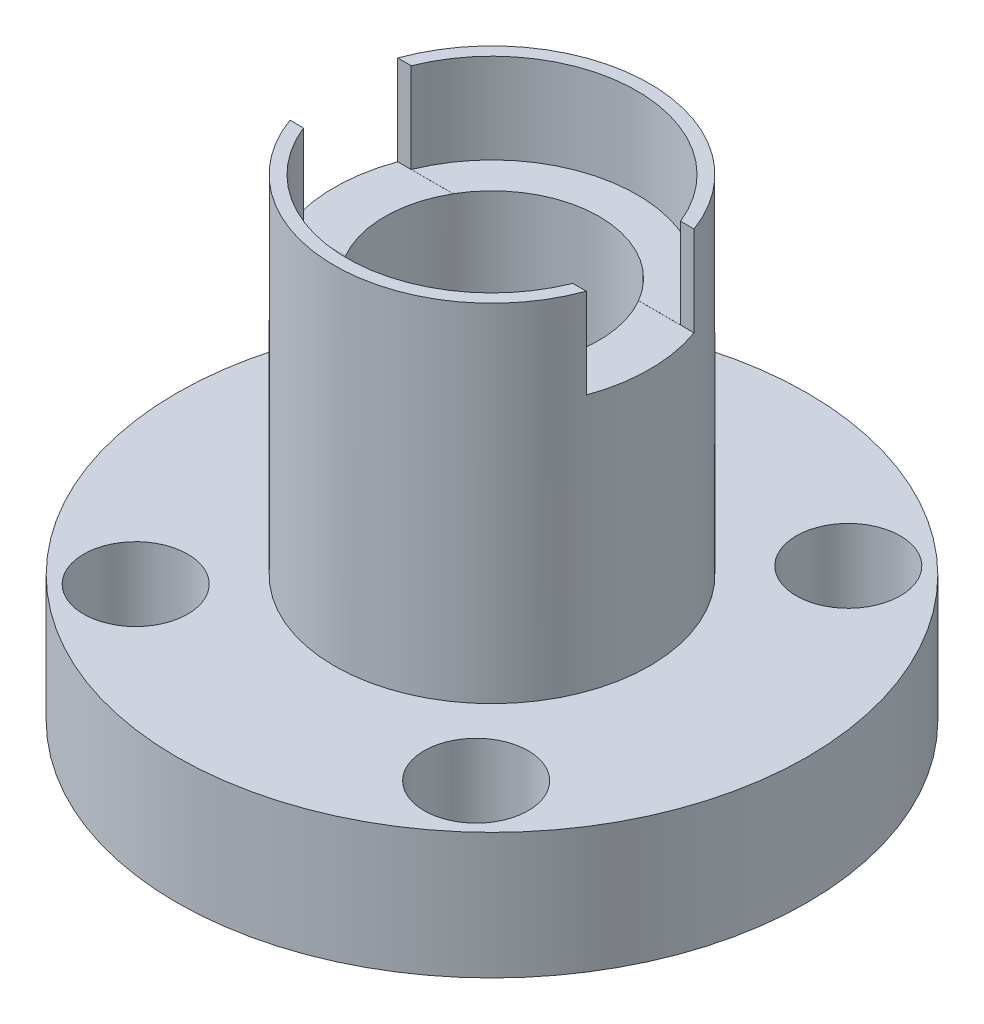
ISO-10303-21;
HEADER;
FILE_DESCRIPTION(('STEP AP214'),'2;1');
FILE_NAME('part.step','',(''),(''),'','','');
FILE_SCHEMA(('AUTOMOTIVE_DESIGN { 1 0 10303 214 1 1 1 1 }'));
ENDSEC;
DATA;
#1=APPLICATION_CONTEXT('core data for automotive mechanical design processes');
#2=APPLICATION_PROTOCOL_DEFINITION('international standard','automotive_design',2000,#1);
#3=PRODUCT_CONTEXT('',#1,'mechanical');
#4=PRODUCT('Part','Part','',(#3));
#5=PRODUCT_RELATED_PRODUCT_CATEGORY('part','',(#4));
#6=PRODUCT_DEFINITION_FORMATION('','',#4);
#7=PRODUCT_DEFINITION_CONTEXT('part definition',#1,'design');
#8=PRODUCT_DEFINITION('design','',#6,#7);
#9=PRODUCT_DEFINITION_SHAPE('','',#8);
#10=(LENGTH_UNIT() NAMED_UNIT(*) SI_UNIT(.MILLI.,.METRE.));
#11=(NAMED_UNIT(*) PLANE_ANGLE_UNIT() SI_UNIT($,.RADIAN.));
#12=(NAMED_UNIT(*) SI_UNIT($,.STERADIAN.) SOLID_ANGLE_UNIT());
#13=UNCERTAINTY_MEASURE_WITH_UNIT(LENGTH_MEASURE(1.E-05),#10,'distance_accuracy_value','');
#14=(GEOMETRIC_REPRESENTATION_CONTEXT(3) GLOBAL_UNCERTAINTY_ASSIGNED_CONTEXT((#13)) GLOBAL_UNIT_ASSIGNED_CONTEXT((#10,
#11,#12)) REPRESENTATION_CONTEXT('',''));
#15=CARTESIAN_POINT('',(0.,0.,0.));
#16=DIRECTION('',(0.,0.,1.));
#17=DIRECTION('',(1.,0.,0.));
#18=AXIS2_PLACEMENT_3D('',#15,#16,#17);
#19=CARTESIAN_POINT('',(0.,15.,0.));
#20=DIRECTION('',(0.,1.,0.));
#21=DIRECTION('',(0.,0.,1.));
#22=AXIS2_PLACEMENT_3D('',#19,#20,#21);
#23=CYLINDRICAL_SURFACE('',#22,3.4);
#24=CARTESIAN_POINT('',(0.,0.,0.));
#25=DIRECTION('',(0.,1.,0.));
#26=DIRECTION('',(0.,0.,1.));
#27=AXIS2_PLACEMENT_3D('',#24,#25,#26);
#28=CIRCLE('',#27,3.4);
#29=CARTESIAN_POINT('',(0.,0.,3.4));
#30=VERTEX_POINT('',#29);
#31=EDGE_CURVE('E214',#30,#30,#28,.T.);
#32=ORIENTED_EDGE('',*,*,#31,.F.);
#33=EDGE_LOOP('',(#32));
#34=FACE_BOUND('',#33,.T.);
#35=CARTESIAN_POINT('',(0.,12.15,0.));
#36=DIRECTION('',(0.,1.,0.));
#37=DIRECTION('',(0.,0.,1.));
#38=AXIS2_PLACEMENT_3D('',#35,#36,#37);
#39=CIRCLE('',#38,3.4);
#40=CARTESIAN_POINT('',(-2.9393133786235,12.15,-1.70892857142857));
#41=VERTEX_POINT('',#40);
#42=CARTESIAN_POINT('',(2.9393133786235,12.15,-1.70892857142856));
#43=VERTEX_POINT('',#42);
#44=EDGE_CURVE('E51',#41,#43,#39,.F.);
#45=ORIENTED_EDGE('',*,*,#44,.F.);
#46=DIRECTION('',(0.,1.,0.));
#47=VECTOR('',#46,1.);
#48=CARTESIAN_POINT('',(-2.9393133786235,15.,-1.70892857142856));
#49=LINE('',#48,#47);
#50=CARTESIAN_POINT('',(-2.9393133786235,12.1475310362426,-1.70892857142857));
#51=VERTEX_POINT('',#50);
#52=EDGE_CURVE('E261',#41,#51,#49,.F.);
#53=ORIENTED_EDGE('',*,*,#52,.T.);
#54=CARTESIAN_POINT('',(0.,12.1475310362426,0.));
#55=DIRECTION('',(0.,-1.,0.));
#56=DIRECTION('',(1.,0.,0.));
#57=AXIS2_PLACEMENT_3D('',#54,#55,#56);
#58=CIRCLE('',#57,3.4);
#59=CARTESIAN_POINT('',(-2.9393133786235,12.1475310362425,1.70892857142857));
#60=VERTEX_POINT('',#59);
#61=EDGE_CURVE('E258',#51,#60,#58,.F.);
#62=ORIENTED_EDGE('',*,*,#61,.T.);
#63=DIRECTION('',(0.,1.,0.));
#64=VECTOR('',#63,1.);
#65=CARTESIAN_POINT('',(-2.9393133786235,15.,1.70892857142857));
#66=LINE('',#65,#64);
#67=CARTESIAN_POINT('',(-2.9393133786235,12.15,1.70892857142857));
#68=VERTEX_POINT('',#67);
#69=EDGE_CURVE('E253',#60,#68,#66,.T.);
#70=ORIENTED_EDGE('',*,*,#69,.T.);
#71=CARTESIAN_POINT('',(2.9393133786235,12.15,1.70892857142857));
#72=VERTEX_POINT('',#71);
#73=EDGE_CURVE('E187',#72,#68,#39,.F.);
#74=ORIENTED_EDGE('',*,*,#73,.F.);
#75=DIRECTION('',(0.,1.,0.));
#76=VECTOR('',#75,1.);
#77=CARTESIAN_POINT('',(2.9393133786235,15.,1.70892857142857));
#78=LINE('',#77,#76);
#79=CARTESIAN_POINT('',(2.9393133786235,12.1475310362425,1.70892857142857));
#80=VERTEX_POINT('',#79);
#81=EDGE_CURVE('E264',#72,#80,#78,.F.);
#82=ORIENTED_EDGE('',*,*,#81,.T.);
#83=CARTESIAN_POINT('',(2.9393133786235,12.1475310362426,-1.70892857142857));
#84=VERTEX_POINT('',#83);
#85=EDGE_CURVE('E262',#80,#84,#58,.F.);
#86=ORIENTED_EDGE('',*,*,#85,.T.);
#87=DIRECTION('',(0.,1.,0.));
#88=VECTOR('',#87,1.);
#89=CARTESIAN_POINT('',(2.9393133786235,15.,-1.70892857142856));
#90=LINE('',#89,#88);
#91=EDGE_CURVE('E266',#84,#43,#90,.T.);
#92=ORIENTED_EDGE('',*,*,#91,.T.);
#93=EDGE_LOOP('',(#45,#53,#62,#70,#74,#82,#86,#92));
#94=FACE_BOUND('',#93,.T.);
#95=ADVANCED_FACE('F36',(#34,#94),#23,.F.);
#96=CARTESIAN_POINT('',(0.,15.,0.));
#97=DIRECTION('',(0.,1.,0.));
#98=DIRECTION('',(0.,0.,1.));
#99=AXIS2_PLACEMENT_3D('',#96,#97,#98);
#100=PLANE('',#99);
#101=CARTESIAN_POINT('',(0.,15.,0.));
#102=DIRECTION('',(0.,1.,0.));
#103=DIRECTION('',(0.,0.,1.));
#104=AXIS2_PLACEMENT_3D('',#101,#102,#103);
#105=CIRCLE('',#104,4.6);
#106=CARTESIAN_POINT('',(4.27078015563376,15.,-1.70892857142856));
#107=VERTEX_POINT('',#106);
#108=CARTESIAN_POINT('',(-4.27078015563376,15.,-1.70892857142856));
#109=VERTEX_POINT('',#108);
#110=EDGE_CURVE('E133',#107,#109,#105,.T.);
#111=ORIENTED_EDGE('',*,*,#110,.F.);
#112=DIRECTION('',(-1.,0.,0.));
#113=VECTOR('',#112,1.);
#114=CARTESIAN_POINT('',(0.,15.,-1.70892857142856));
#115=LINE('',#114,#113);
#116=CARTESIAN_POINT('',(4.69888956432848,15.,-1.70892857142856));
#117=VERTEX_POINT('',#116);
#118=EDGE_CURVE('E200',#117,#107,#115,.T.);
#119=ORIENTED_EDGE('',*,*,#118,.F.);
#120=CARTESIAN_POINT('',(0.,15.,0.));
#121=DIRECTION('',(0.,1.,0.));
#122=DIRECTION('',(0.,0.,1.));
#123=AXIS2_PLACEMENT_3D('',#120,#121,#122);
#124=CIRCLE('',#123,5.);
#125=CARTESIAN_POINT('',(-4.69888956432848,15.,-1.70892857142856));
#126=VERTEX_POINT('',#125);
#127=EDGE_CURVE('E222',#117,#126,#124,.T.);
#128=ORIENTED_EDGE('',*,*,#127,.T.);
#129=EDGE_CURVE('E202',#109,#126,#115,.T.);
#130=ORIENTED_EDGE('',*,*,#129,.F.);
#131=EDGE_LOOP('',(#111,#119,#128,#130));
#132=FACE_BOUND('',#131,.T.);
#133=ADVANCED_FACE('F198',(#132),#100,.T.);
#134=CARTESIAN_POINT('',(0.,4.,0.));
#135=DIRECTION('',(0.,-1.,0.));
#136=DIRECTION('',(0.,0.,-1.));
#137=AXIS2_PLACEMENT_3D('',#134,#135,#136);
#138=CYLINDRICAL_SURFACE('',#137,10.);
#139=CARTESIAN_POINT('',(0.,4.,0.));
#140=DIRECTION('',(0.,1.,0.));
#141=DIRECTION('',(0.,0.,1.));
#142=AXIS2_PLACEMENT_3D('',#139,#140,#141);
#143=CIRCLE('',#142,10.);
#144=CARTESIAN_POINT('',(0.,4.,10.));
#145=VERTEX_POINT('',#144);
#146=EDGE_CURVE('E250',#145,#145,#143,.T.);
#147=ORIENTED_EDGE('',*,*,#146,.F.);
#148=EDGE_LOOP('',(#147));
#149=FACE_BOUND('',#148,.T.);
#150=CARTESIAN_POINT('',(0.,0.,0.));
#151=DIRECTION('',(0.,1.,0.));
#152=DIRECTION('',(0.,0.,1.));
#153=AXIS2_PLACEMENT_3D('',#150,#151,#152);
#154=CIRCLE('',#153,10.);
#155=CARTESIAN_POINT('',(0.,0.,10.));
#156=VERTEX_POINT('',#155);
#157=EDGE_CURVE('E247',#156,#156,#154,.T.);
#158=ORIENTED_EDGE('',*,*,#157,.T.);
#159=EDGE_LOOP('',(#158));
#160=FACE_BOUND('',#159,.T.);
#161=ADVANCED_FACE('F38',(#149,#160),#138,.T.);
#162=CARTESIAN_POINT('',(0.,4.,0.));
#163=DIRECTION('',(0.,1.,0.));
#164=DIRECTION('',(0.,0.,1.));
#165=AXIS2_PLACEMENT_3D('',#162,#163,#164);
#166=PLANE('',#165);
#167=CARTESIAN_POINT('',(0.,4.,0.));
#168=DIRECTION('',(0.,1.,0.));
#169=DIRECTION('',(0.,0.,1.));
#170=AXIS2_PLACEMENT_3D('',#167,#168,#169);
#171=CIRCLE('',#170,5.);
#172=CARTESIAN_POINT('',(0.,4.,5.));
#173=VERTEX_POINT('',#172);
#174=EDGE_CURVE('E218',#173,#173,#171,.T.);
#175=ORIENTED_EDGE('',*,*,#174,.F.);
#176=EDGE_LOOP('',(#175));
#177=FACE_BOUND('',#176,.T.);
#178=CARTESIAN_POINT('',(-5.4001076965695,4.,-5.90244329625036));
#179=DIRECTION('',(0.,-1.,0.));
#180=DIRECTION('',(0.,0.,-1.));
#181=AXIS2_PLACEMENT_3D('',#178,#179,#180);
#182=CIRCLE('',#181,1.65);
#183=CARTESIAN_POINT('',(-5.4001076965695,4.,-7.55244329625036));
#184=VERTEX_POINT('',#183);
#185=EDGE_CURVE('E238',#184,#184,#182,.T.);
#186=ORIENTED_EDGE('',*,*,#185,.T.);
#187=EDGE_LOOP('',(#186));
#188=FACE_BOUND('',#187,.T.);
#189=CARTESIAN_POINT('',(5.4001076965695,4.,-5.90244329625036));
#190=DIRECTION('',(0.,-1.,0.));
#191=DIRECTION('',(0.,0.,-1.));
#192=AXIS2_PLACEMENT_3D('',#189,#190,#191);
#193=CIRCLE('',#192,1.65);
#194=CARTESIAN_POINT('',(5.4001076965695,4.,-7.55244329625036));
#195=VERTEX_POINT('',#194);
#196=EDGE_CURVE('E232',#195,#195,#193,.T.);
#197=ORIENTED_EDGE('',*,*,#196,.T.);
#198=EDGE_LOOP('',(#197));
#199=FACE_BOUND('',#198,.T.);
#200=CARTESIAN_POINT('',(5.4001076965695,4.,5.90244329625036));
#201=DIRECTION('',(0.,-1.,0.));
#202=DIRECTION('',(0.,0.,-1.));
#203=AXIS2_PLACEMENT_3D('',#200,#201,#202);
#204=CIRCLE('',#203,1.65);
#205=CARTESIAN_POINT('',(5.4001076965695,4.,4.25244329625036));
#206=VERTEX_POINT('',#205);
#207=EDGE_CURVE('E225',#206,#206,#204,.T.);
#208=ORIENTED_EDGE('',*,*,#207,.T.);
#209=EDGE_LOOP('',(#208));
#210=FACE_BOUND('',#209,.T.);
#211=CARTESIAN_POINT('',(-5.4001076965695,4.,5.90244329625036));
#212=DIRECTION('',(0.,-1.,0.));
#213=DIRECTION('',(0.,0.,-1.));
#214=AXIS2_PLACEMENT_3D('',#211,#212,#213);
#215=CIRCLE('',#214,1.65);
#216=CARTESIAN_POINT('',(-5.4001076965695,4.,4.25244329625036));
#217=VERTEX_POINT('',#216);
#218=EDGE_CURVE('E244',#217,#217,#215,.T.);
#219=ORIENTED_EDGE('',*,*,#218,.T.);
#220=EDGE_LOOP('',(#219));
#221=FACE_BOUND('',#220,.T.);
#222=ORIENTED_EDGE('',*,*,#146,.T.);
#223=EDGE_LOOP('',(#222));
#224=FACE_BOUND('',#223,.T.);
#225=ADVANCED_FACE('F288',(#177,#188,#199,#210,#221,#224),#166,.T.);
#226=CARTESIAN_POINT('',(0.,0.,0.));
#227=DIRECTION('',(0.,1.,0.));
#228=DIRECTION('',(0.,0.,1.));
#229=AXIS2_PLACEMENT_3D('',#226,#227,#228);
#230=PLANE('',#229);
#231=ORIENTED_EDGE('',*,*,#31,.T.);
#232=EDGE_LOOP('',(#231));
#233=FACE_BOUND('',#232,.T.);
#234=CARTESIAN_POINT('',(-5.4001076965695,0.,-5.90244329625036));
#235=DIRECTION('',(0.,-1.,0.));
#236=DIRECTION('',(0.,0.,-1.));
#237=AXIS2_PLACEMENT_3D('',#234,#235,#236);
#238=CIRCLE('',#237,1.65);
#239=CARTESIAN_POINT('',(-5.4001076965695,0.,-7.55244329625036));
#240=VERTEX_POINT('',#239);
#241=EDGE_CURVE('E241',#240,#240,#238,.T.);
#242=ORIENTED_EDGE('',*,*,#241,.F.);
#243=EDGE_LOOP('',(#242));
#244=FACE_BOUND('',#243,.T.);
#245=CARTESIAN_POINT('',(5.4001076965695,0.,-5.90244329625036));
#246=DIRECTION('',(0.,-1.,0.));
#247=DIRECTION('',(0.,0.,-1.));
#248=AXIS2_PLACEMENT_3D('',#245,#246,#247);
#249=CIRCLE('',#248,1.65);
#250=CARTESIAN_POINT('',(5.4001076965695,0.,-7.55244329625036));
#251=VERTEX_POINT('',#250);
#252=EDGE_CURVE('E235',#251,#251,#249,.T.);
#253=ORIENTED_EDGE('',*,*,#252,.F.);
#254=EDGE_LOOP('',(#253));
#255=FACE_BOUND('',#254,.T.);
#256=CARTESIAN_POINT('',(5.4001076965695,0.,5.90244329625036));
#257=DIRECTION('',(0.,-1.,0.));
#258=DIRECTION('',(0.,0.,-1.));
#259=AXIS2_PLACEMENT_3D('',#256,#257,#258);
#260=CIRCLE('',#259,1.65);
#261=CARTESIAN_POINT('',(5.4001076965695,0.,4.25244329625036));
#262=VERTEX_POINT('',#261);
#263=EDGE_CURVE('E229',#262,#262,#260,.T.);
#264=ORIENTED_EDGE('',*,*,#263,.F.);
#265=EDGE_LOOP('',(#264));
#266=FACE_BOUND('',#265,.T.);
#267=CARTESIAN_POINT('',(-5.4001076965695,0.,5.90244329625036));
#268=DIRECTION('',(0.,-1.,0.));
#269=DIRECTION('',(0.,0.,-1.));
#270=AXIS2_PLACEMENT_3D('',#267,#268,#269);
#271=CIRCLE('',#270,1.65);
#272=CARTESIAN_POINT('',(-5.4001076965695,0.,4.25244329625036));
#273=VERTEX_POINT('',#272);
#274=EDGE_CURVE('E228',#273,#273,#271,.T.);
#275=ORIENTED_EDGE('',*,*,#274,.F.);
#276=EDGE_LOOP('',(#275));
#277=FACE_BOUND('',#276,.T.);
#278=ORIENTED_EDGE('',*,*,#157,.F.);
#279=EDGE_LOOP('',(#278));
#280=FACE_BOUND('',#279,.T.);
#281=ADVANCED_FACE('F291',(#233,#244,#255,#266,#277,#280),#230,.F.);
#282=CARTESIAN_POINT('',(-5.4001076965695,4.,5.90244329625036));
#283=DIRECTION('',(0.,-1.,0.));
#284=DIRECTION('',(0.,0.,-1.));
#285=AXIS2_PLACEMENT_3D('',#282,#283,#284);
#286=CYLINDRICAL_SURFACE('',#285,1.65);
#287=ORIENTED_EDGE('',*,*,#218,.F.);
#288=EDGE_LOOP('',(#287));
#289=FACE_BOUND('',#288,.T.);
#290=ORIENTED_EDGE('',*,*,#274,.T.);
#291=EDGE_LOOP('',(#290));
#292=FACE_BOUND('',#291,.T.);
#293=ADVANCED_FACE('F308',(#289,#292),#286,.F.);
#294=CARTESIAN_POINT('',(5.4001076965695,4.,5.90244329625036));
#295=DIRECTION('',(0.,-1.,0.));
#296=DIRECTION('',(0.,0.,-1.));
#297=AXIS2_PLACEMENT_3D('',#294,#295,#296);
#298=CYLINDRICAL_SURFACE('',#297,1.65);
#299=ORIENTED_EDGE('',*,*,#207,.F.);
#300=EDGE_LOOP('',(#299));
#301=FACE_BOUND('',#300,.T.);
#302=ORIENTED_EDGE('',*,*,#263,.T.);
#303=EDGE_LOOP('',(#302));
#304=FACE_BOUND('',#303,.T.);
#305=ADVANCED_FACE('F313',(#301,#304),#298,.F.);
#306=CARTESIAN_POINT('',(5.4001076965695,4.,-5.90244329625036));
#307=DIRECTION('',(0.,-1.,0.));
#308=DIRECTION('',(0.,0.,-1.));
#309=AXIS2_PLACEMENT_3D('',#306,#307,#308);
#310=CYLINDRICAL_SURFACE('',#309,1.65);
#311=ORIENTED_EDGE('',*,*,#196,.F.);
#312=EDGE_LOOP('',(#311));
#313=FACE_BOUND('',#312,.T.);
#314=ORIENTED_EDGE('',*,*,#252,.T.);
#315=EDGE_LOOP('',(#314));
#316=FACE_BOUND('',#315,.T.);
#317=ADVANCED_FACE('F331',(#313,#316),#310,.F.);
#318=CARTESIAN_POINT('',(-5.4001076965695,4.,-5.90244329625036));
#319=DIRECTION('',(0.,-1.,0.));
#320=DIRECTION('',(0.,0.,-1.));
#321=AXIS2_PLACEMENT_3D('',#318,#319,#320);
#322=CYLINDRICAL_SURFACE('',#321,1.65);
#323=ORIENTED_EDGE('',*,*,#185,.F.);
#324=EDGE_LOOP('',(#323));
#325=FACE_BOUND('',#324,.T.);
#326=ORIENTED_EDGE('',*,*,#241,.T.);
#327=EDGE_LOOP('',(#326));
#328=FACE_BOUND('',#327,.T.);
#329=ADVANCED_FACE('F284',(#325,#328),#322,.F.);
#330=CARTESIAN_POINT('',(0.,15.,0.));
#331=DIRECTION('',(0.,-1.,0.));
#332=DIRECTION('',(0.,0.,-1.));
#333=AXIS2_PLACEMENT_3D('',#330,#331,#332);
#334=CYLINDRICAL_SURFACE('',#333,5.);
#335=CARTESIAN_POINT('',(0.,12.1475310362426,0.));
#336=DIRECTION('',(0.,-1.,0.));
#337=DIRECTION('',(1.,0.,0.));
#338=AXIS2_PLACEMENT_3D('',#335,#336,#337);
#339=CIRCLE('',#338,5.);
#340=CARTESIAN_POINT('',(-4.69888956432848,12.1475310362425,1.70892857142857));
#341=VERTEX_POINT('',#340);
#342=CARTESIAN_POINT('',(-4.69888956432848,12.1475310362425,-1.70892857142857));
#343=VERTEX_POINT('',#342);
#344=EDGE_CURVE('E207',#341,#343,#339,.T.);
#345=ORIENTED_EDGE('',*,*,#344,.T.);
#346=DIRECTION('',(0.,-1.,0.));
#347=VECTOR('',#346,1.);
#348=CARTESIAN_POINT('',(-4.69888956432848,15.,-1.70892857142856));
#349=LINE('',#348,#347);
#350=EDGE_CURVE('E212',#343,#126,#349,.F.);
#351=ORIENTED_EDGE('',*,*,#350,.T.);
#352=ORIENTED_EDGE('',*,*,#127,.F.);
#353=DIRECTION('',(0.,-1.,0.));
#354=VECTOR('',#353,1.);
#355=CARTESIAN_POINT('',(4.69888956432848,15.,-1.70892857142856));
#356=LINE('',#355,#354);
#357=CARTESIAN_POINT('',(4.69888956432848,12.1475310362426,-1.70892857142857));
#358=VERTEX_POINT('',#357);
#359=EDGE_CURVE('E206',#117,#358,#356,.T.);
#360=ORIENTED_EDGE('',*,*,#359,.T.);
#361=CARTESIAN_POINT('',(4.69888956432848,12.1475310362426,1.70892857142857));
#362=VERTEX_POINT('',#361);
#363=EDGE_CURVE('E148',#358,#362,#339,.T.);
#364=ORIENTED_EDGE('',*,*,#363,.T.);
#365=DIRECTION('',(0.,-1.,0.));
#366=VECTOR('',#365,1.);
#367=CARTESIAN_POINT('',(4.69888956432848,15.,1.70892857142857));
#368=LINE('',#367,#366);
#369=CARTESIAN_POINT('',(4.69888956432848,15.,1.70892857142857));
#370=VERTEX_POINT('',#369);
#371=EDGE_CURVE('E144',#362,#370,#368,.F.);
#372=ORIENTED_EDGE('',*,*,#371,.T.);
#373=CARTESIAN_POINT('',(-4.69888956432848,15.,1.70892857142857));
#374=VERTEX_POINT('',#373);
#375=EDGE_CURVE('E143',#374,#370,#124,.T.);
#376=ORIENTED_EDGE('',*,*,#375,.F.);
#377=DIRECTION('',(0.,-1.,0.));
#378=VECTOR('',#377,1.);
#379=CARTESIAN_POINT('',(-4.69888956432848,15.,1.70892857142857));
#380=LINE('',#379,#378);
#381=EDGE_CURVE('E145',#374,#341,#380,.T.);
#382=ORIENTED_EDGE('',*,*,#381,.T.);
#383=EDGE_LOOP('',(#345,#351,#352,#360,#364,#372,#376,#382));
#384=FACE_BOUND('',#383,.T.);
#385=ORIENTED_EDGE('',*,*,#174,.T.);
#386=EDGE_LOOP('',(#385));
#387=FACE_BOUND('',#386,.T.);
#388=ADVANCED_FACE('F281',(#384,#387),#334,.T.);
#389=CARTESIAN_POINT('',(-4.27078015563376,15.,1.70892857142857));
#390=VERTEX_POINT('',#389);
#391=CARTESIAN_POINT('',(4.27078015563376,15.,1.70892857142857));
#392=VERTEX_POINT('',#391);
#393=EDGE_CURVE('E124',#390,#392,#105,.T.);
#394=ORIENTED_EDGE('',*,*,#393,.F.);
#395=DIRECTION('',(1.,0.,0.));
#396=VECTOR('',#395,1.);
#397=CARTESIAN_POINT('',(0.,15.,1.70892857142857));
#398=LINE('',#397,#396);
#399=EDGE_CURVE('E147',#374,#390,#398,.T.);
#400=ORIENTED_EDGE('',*,*,#399,.F.);
#401=ORIENTED_EDGE('',*,*,#375,.T.);
#402=EDGE_CURVE('E137',#392,#370,#398,.T.);
#403=ORIENTED_EDGE('',*,*,#402,.F.);
#404=EDGE_LOOP('',(#394,#400,#401,#403));
#405=FACE_BOUND('',#404,.T.);
#406=ADVANCED_FACE('F141',(#405),#100,.T.);
#407=CARTESIAN_POINT('',(-10.0000000000001,15.0475310362425,1.70892857142857));
#408=DIRECTION('',(0.,0.,1.));
#409=DIRECTION('',(1.,0.,0.));
#410=AXIS2_PLACEMENT_3D('',#407,#408,#409);
#411=PLANE('',#410);
#412=ORIENTED_EDGE('',*,*,#399,.T.);
#413=DIRECTION('',(0.,1.,0.));
#414=VECTOR('',#413,1.);
#415=CARTESIAN_POINT('',(-4.27078015563376,12.15,1.70892857142857));
#416=LINE('',#415,#414);
#417=CARTESIAN_POINT('',(-4.27078015563376,12.15,1.70892857142857));
#418=VERTEX_POINT('',#417);
#419=EDGE_CURVE('E128',#390,#418,#416,.F.);
#420=ORIENTED_EDGE('',*,*,#419,.T.);
#421=DIRECTION('',(-1.,0.,0.));
#422=VECTOR('',#421,1.);
#423=CARTESIAN_POINT('',(-10.0000000000001,12.15,1.70892857142857));
#424=LINE('',#423,#422);
#425=EDGE_CURVE('E185',#68,#418,#424,.T.);
#426=ORIENTED_EDGE('',*,*,#425,.F.);
#427=ORIENTED_EDGE('',*,*,#69,.F.);
#428=DIRECTION('',(1.,0.,0.));
#429=VECTOR('',#428,1.);
#430=CARTESIAN_POINT('',(-10.0000000000001,12.1475310362425,1.70892857142857));
#431=LINE('',#430,#429);
#432=EDGE_CURVE('E162',#341,#60,#431,.T.);
#433=ORIENTED_EDGE('',*,*,#432,.F.);
#434=ORIENTED_EDGE('',*,*,#381,.F.);
#435=EDGE_LOOP('',(#412,#420,#426,#427,#433,#434));
#436=FACE_BOUND('',#435,.T.);
#437=ADVANCED_FACE('F280',(#436),#411,.F.);
#438=CARTESIAN_POINT('',(-10.0000000000001,12.1475310362425,1.70892857142857));
#439=DIRECTION('',(0.,-1.,0.));
#440=DIRECTION('',(1.,0.,0.));
#441=AXIS2_PLACEMENT_3D('',#438,#439,#440);
#442=PLANE('',#441);
#443=ORIENTED_EDGE('',*,*,#432,.T.);
#444=ORIENTED_EDGE('',*,*,#61,.F.);
#445=DIRECTION('',(1.,0.,0.));
#446=VECTOR('',#445,1.);
#447=CARTESIAN_POINT('',(-10.0000000000001,12.1475310362425,-1.70892857142857));
#448=LINE('',#447,#446);
#449=EDGE_CURVE('E153',#343,#51,#448,.T.);
#450=ORIENTED_EDGE('',*,*,#449,.F.);
#451=ORIENTED_EDGE('',*,*,#344,.F.);
#452=EDGE_LOOP('',(#443,#444,#450,#451));
#453=FACE_BOUND('',#452,.T.);
#454=ADVANCED_FACE('F278',(#453),#442,.F.);
#455=CARTESIAN_POINT('',(-10.0000000000001,15.0475310362425,-1.70892857142856));
#456=DIRECTION('',(0.,0.,-1.));
#457=DIRECTION('',(0.,1.,0.));
#458=AXIS2_PLACEMENT_3D('',#455,#456,#457);
#459=PLANE('',#458);
#460=DIRECTION('',(1.,0.,0.));
#461=VECTOR('',#460,1.);
#462=CARTESIAN_POINT('',(-10.0000000000001,12.15,-1.70892857142857));
#463=LINE('',#462,#461);
#464=CARTESIAN_POINT('',(-4.27078015563376,12.15,-1.70892857142857));
#465=VERTEX_POINT('',#464);
#466=EDGE_CURVE('E179',#465,#41,#463,.T.);
#467=ORIENTED_EDGE('',*,*,#466,.F.);
#468=DIRECTION('',(0.,1.,0.));
#469=VECTOR('',#468,1.);
#470=CARTESIAN_POINT('',(-4.27078015563376,12.15,-1.70892857142857));
#471=LINE('',#470,#469);
#472=EDGE_CURVE('E172',#465,#109,#471,.T.);
#473=ORIENTED_EDGE('',*,*,#472,.T.);
#474=ORIENTED_EDGE('',*,*,#129,.T.);
#475=ORIENTED_EDGE('',*,*,#350,.F.);
#476=ORIENTED_EDGE('',*,*,#449,.T.);
#477=ORIENTED_EDGE('',*,*,#52,.F.);
#478=EDGE_LOOP('',(#467,#473,#474,#475,#476,#477));
#479=FACE_BOUND('',#478,.T.);
#480=ADVANCED_FACE('F275',(#479),#459,.F.);
#481=ORIENTED_EDGE('',*,*,#118,.T.);
#482=DIRECTION('',(0.,1.,0.));
#483=VECTOR('',#482,1.);
#484=CARTESIAN_POINT('',(4.27078015563376,12.15,-1.70892857142857));
#485=LINE('',#484,#483);
#486=CARTESIAN_POINT('',(4.27078015563376,12.15,-1.70892857142857));
#487=VERTEX_POINT('',#486);
#488=EDGE_CURVE('E175',#107,#487,#485,.F.);
#489=ORIENTED_EDGE('',*,*,#488,.T.);
#490=DIRECTION('',(1.,0.,0.));
#491=VECTOR('',#490,1.);
#492=CARTESIAN_POINT('',(-10.0000000000001,12.15,-1.70892857142857));
#493=LINE('',#492,#491);
#494=EDGE_CURVE('E183',#43,#487,#493,.T.);
#495=ORIENTED_EDGE('',*,*,#494,.F.);
#496=ORIENTED_EDGE('',*,*,#91,.F.);
#497=EDGE_CURVE('E156',#84,#358,#448,.T.);
#498=ORIENTED_EDGE('',*,*,#497,.T.);
#499=ORIENTED_EDGE('',*,*,#359,.F.);
#500=EDGE_LOOP('',(#481,#489,#495,#496,#498,#499));
#501=FACE_BOUND('',#500,.T.);
#502=ADVANCED_FACE('F204',(#501),#459,.F.);
#503=ORIENTED_EDGE('',*,*,#497,.F.);
#504=ORIENTED_EDGE('',*,*,#85,.F.);
#505=EDGE_CURVE('E165',#80,#362,#431,.T.);
#506=ORIENTED_EDGE('',*,*,#505,.T.);
#507=ORIENTED_EDGE('',*,*,#363,.F.);
#508=EDGE_LOOP('',(#503,#504,#506,#507));
#509=FACE_BOUND('',#508,.T.);
#510=ADVANCED_FACE('F273',(#509),#442,.F.);
#511=DIRECTION('',(-1.,0.,0.));
#512=VECTOR('',#511,1.);
#513=CARTESIAN_POINT('',(-10.0000000000001,12.15,1.70892857142857));
#514=LINE('',#513,#512);
#515=CARTESIAN_POINT('',(4.27078015563376,12.15,1.70892857142857));
#516=VERTEX_POINT('',#515);
#517=EDGE_CURVE('E44',#516,#72,#514,.T.);
#518=ORIENTED_EDGE('',*,*,#517,.F.);
#519=DIRECTION('',(0.,1.,0.));
#520=VECTOR('',#519,1.);
#521=CARTESIAN_POINT('',(4.27078015563376,12.15,1.70892857142857));
#522=LINE('',#521,#520);
#523=EDGE_CURVE('E11',#516,#392,#522,.T.);
#524=ORIENTED_EDGE('',*,*,#523,.T.);
#525=ORIENTED_EDGE('',*,*,#402,.T.);
#526=ORIENTED_EDGE('',*,*,#371,.F.);
#527=ORIENTED_EDGE('',*,*,#505,.F.);
#528=ORIENTED_EDGE('',*,*,#81,.F.);
#529=EDGE_LOOP('',(#518,#524,#525,#526,#527,#528));
#530=FACE_BOUND('',#529,.T.);
#531=ADVANCED_FACE('F136',(#530),#411,.F.);
#532=CARTESIAN_POINT('',(0.,12.15,0.));
#533=DIRECTION('',(0.,1.,0.));
#534=DIRECTION('',(0.,0.,1.));
#535=AXIS2_PLACEMENT_3D('',#532,#533,#534);
#536=PLANE('',#535);
#537=ORIENTED_EDGE('',*,*,#425,.T.);
#538=CARTESIAN_POINT('',(0.,12.15,0.));
#539=DIRECTION('',(0.,1.,0.));
#540=DIRECTION('',(0.,0.,1.));
#541=AXIS2_PLACEMENT_3D('',#538,#539,#540);
#542=CIRCLE('',#541,4.6);
#543=EDGE_CURVE('E59',#418,#516,#542,.T.);
#544=ORIENTED_EDGE('',*,*,#543,.T.);
#545=ORIENTED_EDGE('',*,*,#517,.T.);
#546=ORIENTED_EDGE('',*,*,#73,.T.);
#547=EDGE_LOOP('',(#537,#544,#545,#546));
#548=FACE_BOUND('',#547,.T.);
#549=ADVANCED_FACE('F269',(#548),#536,.T.);
#550=CARTESIAN_POINT('',(0.,12.15,0.));
#551=DIRECTION('',(0.,1.,0.));
#552=DIRECTION('',(0.,0.,1.));
#553=AXIS2_PLACEMENT_3D('',#550,#551,#552);
#554=CYLINDRICAL_SURFACE('',#553,4.6);
#555=ORIENTED_EDGE('',*,*,#393,.T.);
#556=ORIENTED_EDGE('',*,*,#523,.F.);
#557=ORIENTED_EDGE('',*,*,#543,.F.);
#558=ORIENTED_EDGE('',*,*,#419,.F.);
#559=EDGE_LOOP('',(#555,#556,#557,#558));
#560=FACE_BOUND('',#559,.T.);
#561=ADVANCED_FACE('F125',(#560),#554,.F.);
#562=EDGE_CURVE('E188',#487,#465,#542,.T.);
#563=ORIENTED_EDGE('',*,*,#562,.F.);
#564=ORIENTED_EDGE('',*,*,#488,.F.);
#565=ORIENTED_EDGE('',*,*,#110,.T.);
#566=ORIENTED_EDGE('',*,*,#472,.F.);
#567=EDGE_LOOP('',(#563,#564,#565,#566));
#568=FACE_BOUND('',#567,.T.);
#569=ADVANCED_FACE('F194',(#568),#554,.F.);
#570=ORIENTED_EDGE('',*,*,#466,.T.);
#571=ORIENTED_EDGE('',*,*,#44,.T.);
#572=ORIENTED_EDGE('',*,*,#494,.T.);
#573=ORIENTED_EDGE('',*,*,#562,.T.);
#574=EDGE_LOOP('',(#570,#571,#572,#573));
#575=FACE_BOUND('',#574,.T.);
#576=ADVANCED_FACE('F274',(#575),#536,.T.);
#577=CLOSED_SHELL('',(#95,#133,#161,#225,#281,#293,#305,#317,#329,#388,#406,#437,#454,#480,#502,
#510,#531,#549,#561,#569,#576));
#578=MANIFOLD_SOLID_BREP('B2',#577);
#579=ADVANCED_BREP_SHAPE_REPRESENTATION('',(#18,#578),#14);
#580=SHAPE_DEFINITION_REPRESENTATION(#9,#579);
ENDSEC;
END-ISO-10303-21;
